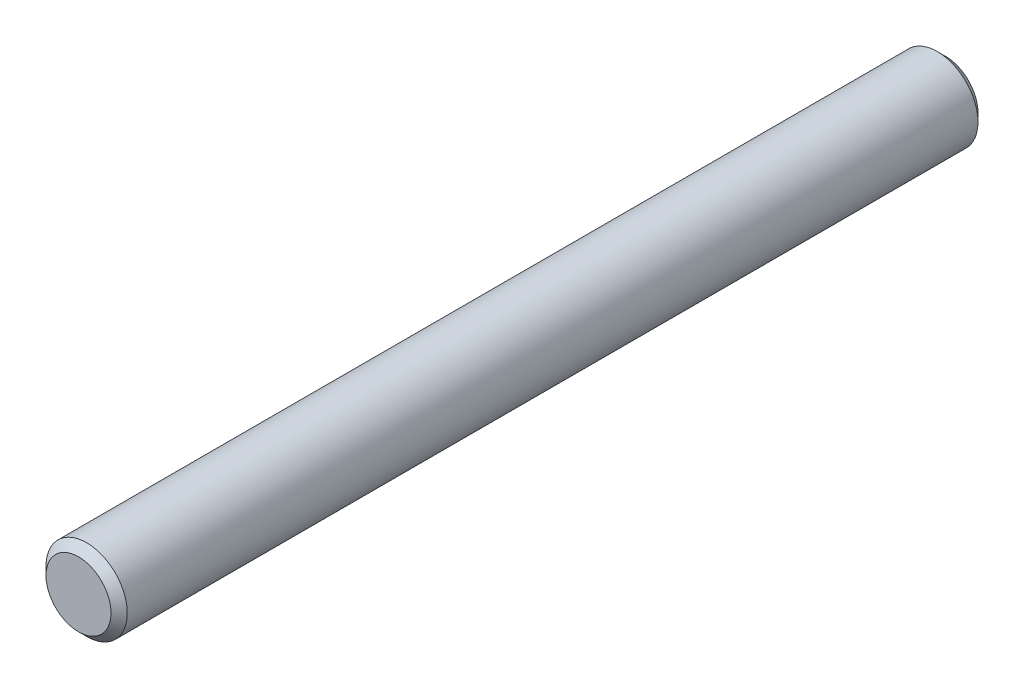
ISO-10303-21;
HEADER;
FILE_DESCRIPTION(('STEP AP214'),'2;1');
FILE_NAME('part.step','',(''),(''),'','','');
FILE_SCHEMA(('AUTOMOTIVE_DESIGN { 1 0 10303 214 1 1 1 1 }'));
ENDSEC;
DATA;
#1=APPLICATION_CONTEXT('core data for automotive mechanical design processes');
#2=APPLICATION_PROTOCOL_DEFINITION('international standard','automotive_design',2000,#1);
#3=PRODUCT_CONTEXT('',#1,'mechanical');
#4=PRODUCT('Part','Part','',(#3));
#5=PRODUCT_RELATED_PRODUCT_CATEGORY('part','',(#4));
#6=PRODUCT_DEFINITION_FORMATION('','',#4);
#7=PRODUCT_DEFINITION_CONTEXT('part definition',#1,'design');
#8=PRODUCT_DEFINITION('design','',#6,#7);
#9=PRODUCT_DEFINITION_SHAPE('','',#8);
#10=(LENGTH_UNIT() NAMED_UNIT(*) SI_UNIT(.MILLI.,.METRE.));
#11=(NAMED_UNIT(*) PLANE_ANGLE_UNIT() SI_UNIT($,.RADIAN.));
#12=(NAMED_UNIT(*) SI_UNIT($,.STERADIAN.) SOLID_ANGLE_UNIT());
#13=UNCERTAINTY_MEASURE_WITH_UNIT(LENGTH_MEASURE(1.E-05),#10,'distance_accuracy_value','');
#14=(GEOMETRIC_REPRESENTATION_CONTEXT(3) GLOBAL_UNCERTAINTY_ASSIGNED_CONTEXT((#13)) GLOBAL_UNIT_ASSIGNED_CONTEXT((#10,
#11,#12)) REPRESENTATION_CONTEXT('',''));
#15=CARTESIAN_POINT('',(0.,0.,0.));
#16=DIRECTION('',(0.,0.,1.));
#17=DIRECTION('',(1.,0.,0.));
#18=AXIS2_PLACEMENT_3D('',#15,#16,#17);
#19=CARTESIAN_POINT('',(0.,0.,25.4));
#20=DIRECTION('',(0.,0.,-1.));
#21=DIRECTION('',(-1.,0.,0.));
#22=AXIS2_PLACEMENT_3D('',#19,#20,#21);
#23=CYLINDRICAL_SURFACE('',#22,2.38125);
#24=CARTESIAN_POINT('',(0.,0.,-24.92375));
#25=DIRECTION('',(0.,0.,1.));
#26=DIRECTION('',(1.,0.,0.));
#27=AXIS2_PLACEMENT_3D('',#24,#25,#26);
#28=CIRCLE('',#27,2.38125);
#29=CARTESIAN_POINT('',(-2.38125,0.,-24.92375));
#30=VERTEX_POINT('',#29);
#31=EDGE_CURVE('E43',#30,#30,#28,.T.);
#32=CARTESIAN_POINT('',(0.,0.,24.92375));
#33=DIRECTION('',(0.,0.,1.));
#34=DIRECTION('',(1.,0.,0.));
#35=AXIS2_PLACEMENT_3D('',#32,#33,#34);
#36=CIRCLE('',#35,2.38125);
#37=CARTESIAN_POINT('',(-2.38125,0.,24.92375));
#38=VERTEX_POINT('',#37);
#39=EDGE_CURVE('E47',#38,#38,#36,.F.);
#40=CARTESIAN_POINT('',(-2.38125,0.,-24.92375));
#41=CARTESIAN_POINT('',(-2.38125,0.,-24.4045052083333));
#42=CARTESIAN_POINT('',(-2.38125,0.,-23.8852604166666));
#43=CARTESIAN_POINT('',(-2.38125,0.,-22.8467708333333));
#44=CARTESIAN_POINT('',(-2.38125,0.,-22.3275260416666));
#45=CARTESIAN_POINT('',(-2.38125,0.,-21.2890364583333));
#46=CARTESIAN_POINT('',(-2.38125,0.,-20.7697916666666));
#47=CARTESIAN_POINT('',(-2.38125,0.,-19.7313020833333));
#48=CARTESIAN_POINT('',(-2.38125,0.,-19.2120572916666));
#49=CARTESIAN_POINT('',(-2.38125,0.,-18.1735677083333));
#50=CARTESIAN_POINT('',(-2.38125,0.,-17.6543229166666));
#51=CARTESIAN_POINT('',(-2.38125,0.,-16.6158333333333));
#52=CARTESIAN_POINT('',(-2.38125,0.,-16.0965885416666));
#53=CARTESIAN_POINT('',(-2.38125,0.,-15.0580989583333));
#54=CARTESIAN_POINT('',(-2.38125,0.,-14.5388541666666));
#55=CARTESIAN_POINT('',(-2.38125,0.,-13.5003645833333));
#56=CARTESIAN_POINT('',(-2.38125,0.,-12.9811197916666));
#57=CARTESIAN_POINT('',(-2.38125,0.,-11.9426302083333));
#58=CARTESIAN_POINT('',(-2.38125,0.,-11.4233854166666));
#59=CARTESIAN_POINT('',(-2.38125,0.,-10.3848958333333));
#60=CARTESIAN_POINT('',(-2.38125,0.,-9.86565104166665));
#61=CARTESIAN_POINT('',(-2.38125,0.,-8.82716145833332));
#62=CARTESIAN_POINT('',(-2.38125,0.,-8.30791666666665));
#63=CARTESIAN_POINT('',(-2.38125,0.,-7.26942708333332));
#64=CARTESIAN_POINT('',(-2.38125,0.,-6.75018229166665));
#65=CARTESIAN_POINT('',(-2.38125,0.,-5.71169270833332));
#66=CARTESIAN_POINT('',(-2.38125,0.,-5.19244791666665));
#67=CARTESIAN_POINT('',(-2.38125,0.,-4.15395833333332));
#68=CARTESIAN_POINT('',(-2.38125,0.,-3.63471354166665));
#69=CARTESIAN_POINT('',(-2.38125,0.,-2.59622395833332));
#70=CARTESIAN_POINT('',(-2.38125,0.,-2.07697916666665));
#71=CARTESIAN_POINT('',(-2.38125,0.,-1.03848958333332));
#72=CARTESIAN_POINT('',(-2.38125,0.,-0.519244791666656));
#73=CARTESIAN_POINT('',(-2.38125,0.,0.519244791666676));
#74=CARTESIAN_POINT('',(-2.38125,0.,1.03848958333334));
#75=CARTESIAN_POINT('',(-2.38125,0.,2.07697916666667));
#76=CARTESIAN_POINT('',(-2.38125,0.,2.59622395833334));
#77=CARTESIAN_POINT('',(-2.38125,0.,3.63471354166667));
#78=CARTESIAN_POINT('',(-2.38125,0.,4.15395833333334));
#79=CARTESIAN_POINT('',(-2.38125,0.,5.19244791666667));
#80=CARTESIAN_POINT('',(-2.38125,0.,5.71169270833334));
#81=CARTESIAN_POINT('',(-2.38125,0.,6.75018229166667));
#82=CARTESIAN_POINT('',(-2.38125,0.,7.26942708333334));
#83=CARTESIAN_POINT('',(-2.38125,0.,8.30791666666667));
#84=CARTESIAN_POINT('',(-2.38125,0.,8.82716145833333));
#85=CARTESIAN_POINT('',(-2.38125,0.,9.86565104166667));
#86=CARTESIAN_POINT('',(-2.38125,0.,10.3848958333333));
#87=CARTESIAN_POINT('',(-2.38125,0.,11.4233854166667));
#88=CARTESIAN_POINT('',(-2.38125,0.,11.9426302083333));
#89=CARTESIAN_POINT('',(-2.38125,0.,12.9811197916667));
#90=CARTESIAN_POINT('',(-2.38125,0.,13.5003645833333));
#91=CARTESIAN_POINT('',(-2.38125,0.,14.5388541666667));
#92=CARTESIAN_POINT('',(-2.38125,0.,15.0580989583333));
#93=CARTESIAN_POINT('',(-2.38125,0.,16.0965885416667));
#94=CARTESIAN_POINT('',(-2.38125,0.,16.6158333333333));
#95=CARTESIAN_POINT('',(-2.38125,0.,17.6543229166667));
#96=CARTESIAN_POINT('',(-2.38125,0.,18.1735677083333));
#97=CARTESIAN_POINT('',(-2.38125,0.,19.2120572916667));
#98=CARTESIAN_POINT('',(-2.38125,0.,19.7313020833333));
#99=CARTESIAN_POINT('',(-2.38125,0.,20.7697916666667));
#100=CARTESIAN_POINT('',(-2.38125,0.,21.2890364583333));
#101=CARTESIAN_POINT('',(-2.38125,0.,22.3275260416667));
#102=CARTESIAN_POINT('',(-2.38125,0.,22.8467708333333));
#103=CARTESIAN_POINT('',(-2.38125,0.,23.8852604166667));
#104=CARTESIAN_POINT('',(-2.38125,0.,24.4045052083333));
#105=CARTESIAN_POINT('',(-2.38125,0.,24.92375));
#106=B_SPLINE_CURVE_WITH_KNOTS('',3,(#40,#41,#42,#43,#44,#45,#46,#47,#48,#49,#50,#51,#52,#53,
#54,#55,#56,#57,#58,#59,#60,#61,#62,#63,#64,#65,#66,#67,#68,#69,#70,#71,#72,#73,#74,#75,#76,#77,
#78,#79,#80,#81,#82,#83,#84,#85,#86,#87,#88,#89,#90,#91,#92,#93,#94,#95,#96,#97,#98,#99,#100,
#101,#102,#103,#104,#105),.UNSPECIFIED.,.F.,.F.,(4,2,2,2,2,2,2,2,2,2,2,2,2,2,2,2,2,2,2,2,2,2,2,
2,2,2,2,2,2,2,2,2,4),(0.,1.557734375,3.11546875,4.673203125,6.23093749999999,7.78867187499999,
9.34640624999999,10.904140625,12.461875,14.019609375,15.57734375,17.135078125,18.6928125,
20.250546875,21.80828125,23.366015625,24.92375,26.481484375,28.03921875,29.596953125,31.1546875,
32.712421875,34.27015625,35.827890625,37.385625,38.943359375,40.50109375,42.058828125,
43.6165625,45.174296875,46.73203125,48.289765625,49.8475),.UNSPECIFIED.);
#107=EDGE_CURVE('BSEAM32',#30,#38,#106,.T.);
#108=ORIENTED_EDGE('',*,*,#31,.T.);
#109=ORIENTED_EDGE('',*,*,#39,.T.);
#110=ORIENTED_EDGE('',*,*,#107,.T.);
#111=ORIENTED_EDGE('',*,*,#107,.F.);
#112=EDGE_LOOP('',(#108,#110,#109,#111));
#113=FACE_BOUND('',#112,.T.);
#114=ADVANCED_FACE('F32',(#113),#23,.T.);
#115=CARTESIAN_POINT('',(0.,0.,25.4));
#116=DIRECTION('',(0.,0.,1.));
#117=DIRECTION('',(1.,0.,0.));
#118=AXIS2_PLACEMENT_3D('',#115,#116,#117);
#119=PLANE('',#118);
#120=CARTESIAN_POINT('',(0.,0.,25.4));
#121=DIRECTION('',(0.,0.,1.));
#122=DIRECTION('',(1.,0.,0.));
#123=AXIS2_PLACEMENT_3D('',#120,#121,#122);
#124=CIRCLE('',#123,1.90500000000002);
#125=CARTESIAN_POINT('',(-1.90500000000002,0.,25.4));
#126=VERTEX_POINT('',#125);
#127=EDGE_CURVE('E10',#126,#126,#124,.T.);
#128=ORIENTED_EDGE('',*,*,#127,.T.);
#129=EDGE_LOOP('',(#128));
#130=FACE_BOUND('',#129,.T.);
#131=ADVANCED_FACE('F63',(#130),#119,.T.);
#132=CARTESIAN_POINT('',(0.,0.,-25.4));
#133=DIRECTION('',(0.,0.,1.));
#134=DIRECTION('',(1.,0.,0.));
#135=AXIS2_PLACEMENT_3D('',#132,#133,#134);
#136=PLANE('',#135);
#137=CARTESIAN_POINT('',(0.,0.,-25.4));
#138=DIRECTION('',(0.,0.,1.));
#139=DIRECTION('',(1.,0.,0.));
#140=AXIS2_PLACEMENT_3D('',#137,#138,#139);
#141=CIRCLE('',#140,1.90499999999999);
#142=CARTESIAN_POINT('',(1.90499999999999,0.,-25.4));
#143=VERTEX_POINT('',#142);
#144=EDGE_CURVE('E39',#143,#143,#141,.F.);
#145=ORIENTED_EDGE('',*,*,#144,.T.);
#146=EDGE_LOOP('',(#145));
#147=FACE_BOUND('',#146,.T.);
#148=ADVANCED_FACE('F60',(#147),#136,.F.);
#149=CARTESIAN_POINT('',(0.,0.,-24.92375));
#150=DIRECTION('',(0.,0.,1.));
#151=DIRECTION('',(1.,0.,0.));
#152=AXIS2_PLACEMENT_3D('',#149,#150,#151);
#153=CONICAL_SURFACE('',#152,2.38125,0.785398163397447);
#154=ORIENTED_EDGE('',*,*,#144,.F.);
#155=EDGE_LOOP('',(#154));
#156=FACE_BOUND('',#155,.T.);
#157=ORIENTED_EDGE('',*,*,#31,.F.);
#158=EDGE_LOOP('',(#157));
#159=FACE_BOUND('',#158,.T.);
#160=ADVANCED_FACE('F56',(#156,#159),#153,.T.);
#161=CARTESIAN_POINT('',(0.,0.,25.4));
#162=DIRECTION('',(0.,0.,-1.));
#163=DIRECTION('',(-1.,0.,0.));
#164=AXIS2_PLACEMENT_3D('',#161,#162,#163);
#165=CONICAL_SURFACE('',#164,1.90500000000002,0.78539816339744);
#166=CARTESIAN_POINT('',(-2.38125,0.,24.92375));
#167=CARTESIAN_POINT('',(-2.3762890625,0.,24.9287109375));
#168=CARTESIAN_POINT('',(-2.371328125,0.,24.933671875));
#169=CARTESIAN_POINT('',(-2.36140625,0.,24.94359375));
#170=CARTESIAN_POINT('',(-2.3564453125,0.,24.9485546875));
#171=CARTESIAN_POINT('',(-2.3465234375,0.,24.9584765625));
#172=CARTESIAN_POINT('',(-2.3415625,0.,24.9634375));
#173=CARTESIAN_POINT('',(-2.331640625,0.,24.973359375));
#174=CARTESIAN_POINT('',(-2.3266796875,0.,24.9783203125));
#175=CARTESIAN_POINT('',(-2.31675781250001,0.,24.9882421875));
#176=CARTESIAN_POINT('',(-2.311796875,0.,24.993203125));
#177=CARTESIAN_POINT('',(-2.301875,0.,25.003125));
#178=CARTESIAN_POINT('',(-2.2969140625,0.,25.0080859375));
#179=CARTESIAN_POINT('',(-2.28699218750001,0.,25.0180078125));
#180=CARTESIAN_POINT('',(-2.28203125000001,0.,25.02296875));
#181=CARTESIAN_POINT('',(-2.27210937500001,0.,25.032890625));
#182=CARTESIAN_POINT('',(-2.26714843750001,0.,25.0378515625));
#183=CARTESIAN_POINT('',(-2.25722656250001,0.,25.0477734375));
#184=CARTESIAN_POINT('',(-2.25226562500001,0.,25.052734375));
#185=CARTESIAN_POINT('',(-2.24234375000001,0.,25.06265625));
#186=CARTESIAN_POINT('',(-2.23738281250001,0.,25.0676171875));
#187=CARTESIAN_POINT('',(-2.22746093750001,0.,25.0775390625));
#188=CARTESIAN_POINT('',(-2.22250000000001,0.,25.0825));
#189=CARTESIAN_POINT('',(-2.21257812500001,0.,25.092421875));
#190=CARTESIAN_POINT('',(-2.20761718750001,0.,25.0973828125));
#191=CARTESIAN_POINT('',(-2.19769531250001,0.,25.1073046875));
#192=CARTESIAN_POINT('',(-2.19273437500001,0.,25.112265625));
#193=CARTESIAN_POINT('',(-2.18281250000001,0.,25.1221875));
#194=CARTESIAN_POINT('',(-2.17785156250001,0.,25.1271484375));
#195=CARTESIAN_POINT('',(-2.16792968750001,0.,25.1370703125));
#196=CARTESIAN_POINT('',(-2.16296875000001,0.,25.14203125));
#197=CARTESIAN_POINT('',(-2.15304687500001,0.,25.151953125));
#198=CARTESIAN_POINT('',(-2.14808593750001,0.,25.1569140625));
#199=CARTESIAN_POINT('',(-2.13816406250001,0.,25.1668359375));
#200=CARTESIAN_POINT('',(-2.13320312500001,0.,25.171796875));
#201=CARTESIAN_POINT('',(-2.12328125000001,0.,25.18171875));
#202=CARTESIAN_POINT('',(-2.11832031250001,0.,25.1866796875));
#203=CARTESIAN_POINT('',(-2.10839843750001,0.,25.1966015625));
#204=CARTESIAN_POINT('',(-2.10343750000001,0.,25.2015625));
#205=CARTESIAN_POINT('',(-2.09351562500001,0.,25.211484375));
#206=CARTESIAN_POINT('',(-2.08855468750001,0.,25.2164453125));
#207=CARTESIAN_POINT('',(-2.07863281250001,0.,25.2263671875));
#208=CARTESIAN_POINT('',(-2.07367187500001,0.,25.231328125));
#209=CARTESIAN_POINT('',(-2.06375000000001,0.,25.24125));
#210=CARTESIAN_POINT('',(-2.05878906250001,0.,25.2462109375));
#211=CARTESIAN_POINT('',(-2.04886718750001,0.,25.2561328125));
#212=CARTESIAN_POINT('',(-2.04390625000001,0.,25.26109375));
#213=CARTESIAN_POINT('',(-2.03398437500001,0.,25.271015625));
#214=CARTESIAN_POINT('',(-2.02902343750001,0.,25.2759765625));
#215=CARTESIAN_POINT('',(-2.01910156250002,0.,25.2858984375));
#216=CARTESIAN_POINT('',(-2.01414062500002,0.,25.290859375));
#217=CARTESIAN_POINT('',(-2.00421875000002,0.,25.30078125));
#218=CARTESIAN_POINT('',(-1.99925781250002,0.,25.3057421875));
#219=CARTESIAN_POINT('',(-1.98933593750002,0.,25.3156640625));
#220=CARTESIAN_POINT('',(-1.98437500000002,0.,25.320625));
#221=CARTESIAN_POINT('',(-1.97445312500002,0.,25.330546875));
#222=CARTESIAN_POINT('',(-1.96949218750002,0.,25.3355078125));
#223=CARTESIAN_POINT('',(-1.95957031250002,0.,25.3454296875));
#224=CARTESIAN_POINT('',(-1.95460937500002,0.,25.350390625));
#225=CARTESIAN_POINT('',(-1.94468750000002,0.,25.3603125));
#226=CARTESIAN_POINT('',(-1.93972656250002,0.,25.3652734375));
#227=CARTESIAN_POINT('',(-1.92980468750002,0.,25.3751953125));
#228=CARTESIAN_POINT('',(-1.92484375000002,0.,25.38015625));
#229=CARTESIAN_POINT('',(-1.91492187500002,0.,25.390078125));
#230=CARTESIAN_POINT('',(-1.90996093750002,0.,25.3950390625));
#231=CARTESIAN_POINT('',(-1.90500000000002,0.,25.4));
#232=B_SPLINE_CURVE_WITH_KNOTS('',3,(#166,#167,#168,#169,#170,#171,#172,#173,#174,#175,#176,
#177,#178,#179,#180,#181,#182,#183,#184,#185,#186,#187,#188,#189,#190,#191,#192,#193,#194,#195,
#196,#197,#198,#199,#200,#201,#202,#203,#204,#205,#206,#207,#208,#209,#210,#211,#212,#213,#214,
#215,#216,#217,#218,#219,#220,#221,#222,#223,#224,#225,#226,#227,#228,#229,#230,#231),
.UNSPECIFIED.,.F.,.F.,(4,2,2,2,2,2,2,2,2,2,2,2,2,2,2,2,2,2,2,2,2,2,2,2,2,2,2,2,2,2,2,2,4),(0.,
0.0210474752837569,0.0420949505675114,0.0631424258512656,0.0841899011350226,0.105237376418777,
0.126284851702532,0.147332326986288,0.168379802270043,0.189427277553797,0.210474752837554,
0.231522228121309,0.252569703405063,0.27361717868882,0.294664653972575,0.315712129256329,
0.336759604540083,0.35780707982384,0.378854555107595,0.399902030391349,0.420949505675106,
0.441996980958861,0.463044456242615,0.484091931526372,0.505139406810127,0.526186882093881,
0.547234357377638,0.568281832661392,0.589329307945147,0.610376783228904,0.631424258512658,
0.652471733796413,0.67351920908017),.UNSPECIFIED.);
#233=EDGE_CURVE('BSEAM34',#38,#126,#232,.T.);
#234=ORIENTED_EDGE('',*,*,#39,.F.);
#235=ORIENTED_EDGE('',*,*,#127,.F.);
#236=ORIENTED_EDGE('',*,*,#233,.T.);
#237=ORIENTED_EDGE('',*,*,#233,.F.);
#238=EDGE_LOOP('',(#234,#236,#235,#237));
#239=FACE_BOUND('',#238,.T.);
#240=ADVANCED_FACE('F34',(#239),#165,.T.);
#241=CLOSED_SHELL('',(#114,#131,#148,#160,#240));
#242=MANIFOLD_SOLID_BREP('B2',#241);
#243=ADVANCED_BREP_SHAPE_REPRESENTATION('',(#18,#242),#14);
#244=SHAPE_DEFINITION_REPRESENTATION(#9,#243);
ENDSEC;
END-ISO-10303-21;
